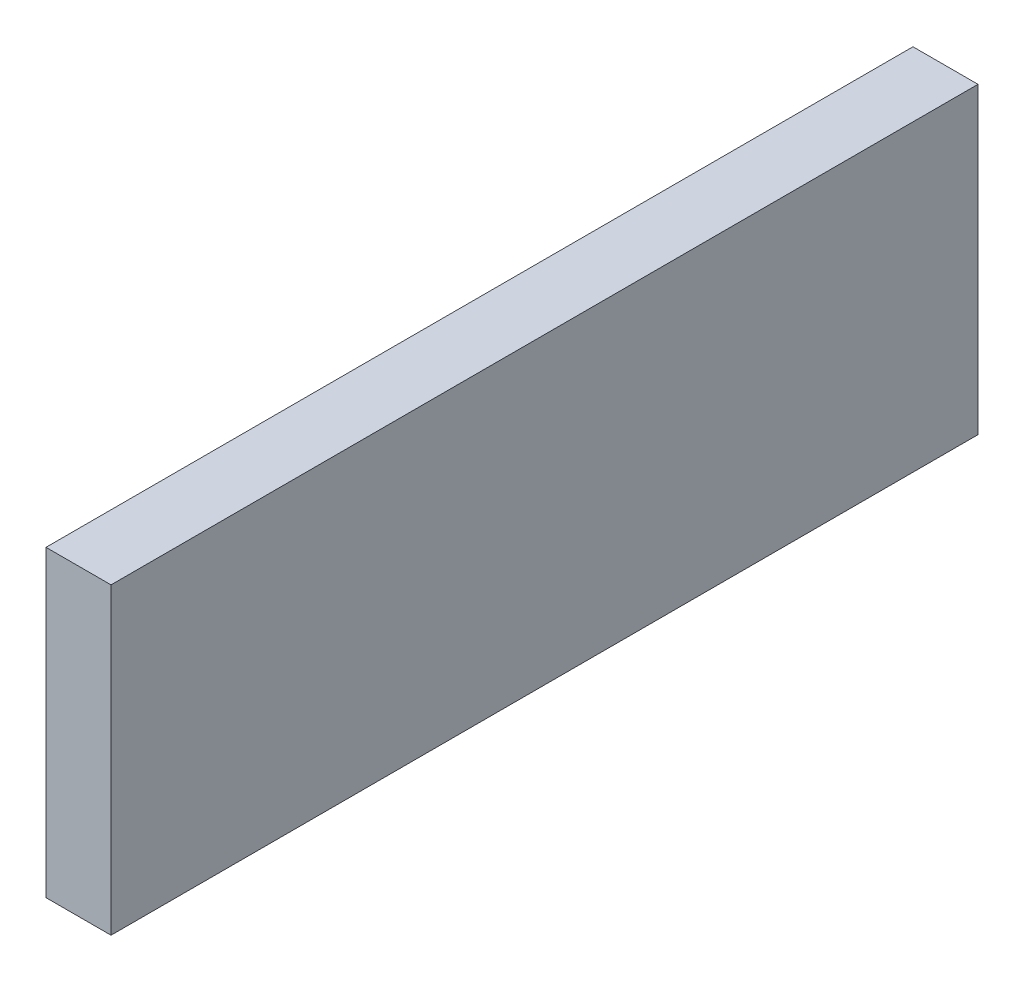
ISO-10303-21;
HEADER;
FILE_DESCRIPTION(('STEP AP214'),'2;1');
FILE_NAME('part.step','',(''),(''),'','','');
FILE_SCHEMA(('AUTOMOTIVE_DESIGN { 1 0 10303 214 1 1 1 1 }'));
ENDSEC;
DATA;
#1=APPLICATION_CONTEXT('core data for automotive mechanical design processes');
#2=APPLICATION_PROTOCOL_DEFINITION('international standard','automotive_design',2000,#1);
#3=PRODUCT_CONTEXT('',#1,'mechanical');
#4=PRODUCT('Part','Part','',(#3));
#5=PRODUCT_RELATED_PRODUCT_CATEGORY('part','',(#4));
#6=PRODUCT_DEFINITION_FORMATION('','',#4);
#7=PRODUCT_DEFINITION_CONTEXT('part definition',#1,'design');
#8=PRODUCT_DEFINITION('design','',#6,#7);
#9=PRODUCT_DEFINITION_SHAPE('','',#8);
#10=(LENGTH_UNIT() NAMED_UNIT(*) SI_UNIT(.MILLI.,.METRE.));
#11=(NAMED_UNIT(*) PLANE_ANGLE_UNIT() SI_UNIT($,.RADIAN.));
#12=(NAMED_UNIT(*) SI_UNIT($,.STERADIAN.) SOLID_ANGLE_UNIT());
#13=UNCERTAINTY_MEASURE_WITH_UNIT(LENGTH_MEASURE(1.E-05),#10,'distance_accuracy_value','');
#14=(GEOMETRIC_REPRESENTATION_CONTEXT(3) GLOBAL_UNCERTAINTY_ASSIGNED_CONTEXT((#13)) GLOBAL_UNIT_ASSIGNED_CONTEXT((#10,
#11,#12)) REPRESENTATION_CONTEXT('',''));
#15=CARTESIAN_POINT('',(0.,0.,0.));
#16=DIRECTION('',(0.,0.,1.));
#17=DIRECTION('',(1.,0.,0.));
#18=AXIS2_PLACEMENT_3D('',#15,#16,#17);
#19=CARTESIAN_POINT('',(3.,-7.,-20.));
#20=DIRECTION('',(0.,0.,1.));
#21=DIRECTION('',(1.,0.,0.));
#22=AXIS2_PLACEMENT_3D('',#19,#20,#21);
#23=PLANE('',#22);
#24=DIRECTION('',(0.,1.,0.));
#25=VECTOR('',#24,1.);
#26=CARTESIAN_POINT('',(0.,-7.,-20.));
#27=LINE('',#26,#25);
#28=CARTESIAN_POINT('',(0.,-7.,-20.));
#29=VERTEX_POINT('',#28);
#30=CARTESIAN_POINT('',(0.,7.,-20.));
#31=VERTEX_POINT('',#30);
#32=EDGE_CURVE('E96',#29,#31,#27,.T.);
#33=ORIENTED_EDGE('',*,*,#32,.T.);
#34=DIRECTION('',(-1.,0.,0.));
#35=VECTOR('',#34,1.);
#36=CARTESIAN_POINT('',(3.,7.,-20.));
#37=LINE('',#36,#35);
#38=CARTESIAN_POINT('',(3.,7.,-20.));
#39=VERTEX_POINT('',#38);
#40=EDGE_CURVE('E11',#39,#31,#37,.T.);
#41=ORIENTED_EDGE('',*,*,#40,.F.);
#42=DIRECTION('',(0.,1.,0.));
#43=VECTOR('',#42,1.);
#44=CARTESIAN_POINT('',(3.,-7.,-20.));
#45=LINE('',#44,#43);
#46=CARTESIAN_POINT('',(3.,-7.,-20.));
#47=VERTEX_POINT('',#46);
#48=EDGE_CURVE('E84',#47,#39,#45,.T.);
#49=ORIENTED_EDGE('',*,*,#48,.F.);
#50=DIRECTION('',(-1.,0.,0.));
#51=VECTOR('',#50,1.);
#52=CARTESIAN_POINT('',(3.,-7.,-20.));
#53=LINE('',#52,#51);
#54=EDGE_CURVE('E92',#47,#29,#53,.T.);
#55=ORIENTED_EDGE('',*,*,#54,.T.);
#56=EDGE_LOOP('',(#33,#41,#49,#55));
#57=FACE_BOUND('',#56,.T.);
#58=ADVANCED_FACE('F33',(#57),#23,.F.);
#59=CARTESIAN_POINT('',(3.,7.,20.));
#60=DIRECTION('',(0.,-1.,0.));
#61=DIRECTION('',(0.,0.,-1.));
#62=AXIS2_PLACEMENT_3D('',#59,#60,#61);
#63=PLANE('',#62);
#64=DIRECTION('',(0.,0.,1.));
#65=VECTOR('',#64,1.);
#66=CARTESIAN_POINT('',(0.,7.,20.));
#67=LINE('',#66,#65);
#68=CARTESIAN_POINT('',(0.,7.,20.));
#69=VERTEX_POINT('',#68);
#70=EDGE_CURVE('E88',#31,#69,#67,.T.);
#71=ORIENTED_EDGE('',*,*,#70,.T.);
#72=DIRECTION('',(-1.,0.,0.));
#73=VECTOR('',#72,1.);
#74=CARTESIAN_POINT('',(3.,7.,20.));
#75=LINE('',#74,#73);
#76=CARTESIAN_POINT('',(3.,7.,20.));
#77=VERTEX_POINT('',#76);
#78=EDGE_CURVE('E41',#77,#69,#75,.T.);
#79=ORIENTED_EDGE('',*,*,#78,.F.);
#80=DIRECTION('',(0.,0.,1.));
#81=VECTOR('',#80,1.);
#82=CARTESIAN_POINT('',(3.,7.,20.));
#83=LINE('',#82,#81);
#84=EDGE_CURVE('E79',#39,#77,#83,.T.);
#85=ORIENTED_EDGE('',*,*,#84,.F.);
#86=ORIENTED_EDGE('',*,*,#40,.T.);
#87=EDGE_LOOP('',(#71,#79,#85,#86));
#88=FACE_BOUND('',#87,.T.);
#89=ADVANCED_FACE('F87',(#88),#63,.F.);
#90=CARTESIAN_POINT('',(3.,-7.,20.));
#91=DIRECTION('',(0.,0.,-1.));
#92=DIRECTION('',(-1.,0.,0.));
#93=AXIS2_PLACEMENT_3D('',#90,#91,#92);
#94=PLANE('',#93);
#95=DIRECTION('',(0.,-1.,0.));
#96=VECTOR('',#95,1.);
#97=CARTESIAN_POINT('',(0.,-7.,20.));
#98=LINE('',#97,#96);
#99=CARTESIAN_POINT('',(0.,-7.,20.));
#100=VERTEX_POINT('',#99);
#101=EDGE_CURVE('E66',#69,#100,#98,.T.);
#102=ORIENTED_EDGE('',*,*,#101,.T.);
#103=DIRECTION('',(-1.,0.,0.));
#104=VECTOR('',#103,1.);
#105=CARTESIAN_POINT('',(3.,-7.,20.));
#106=LINE('',#105,#104);
#107=CARTESIAN_POINT('',(3.,-7.,20.));
#108=VERTEX_POINT('',#107);
#109=EDGE_CURVE('E89',#108,#100,#106,.T.);
#110=ORIENTED_EDGE('',*,*,#109,.F.);
#111=DIRECTION('',(0.,-1.,0.));
#112=VECTOR('',#111,1.);
#113=CARTESIAN_POINT('',(3.,-7.,20.));
#114=LINE('',#113,#112);
#115=EDGE_CURVE('E82',#77,#108,#114,.T.);
#116=ORIENTED_EDGE('',*,*,#115,.F.);
#117=ORIENTED_EDGE('',*,*,#78,.T.);
#118=EDGE_LOOP('',(#102,#110,#116,#117));
#119=FACE_BOUND('',#118,.T.);
#120=ADVANCED_FACE('F90',(#119),#94,.F.);
#121=CARTESIAN_POINT('',(3.,-7.,20.));
#122=DIRECTION('',(0.,1.,0.));
#123=DIRECTION('',(0.,0.,1.));
#124=AXIS2_PLACEMENT_3D('',#121,#122,#123);
#125=PLANE('',#124);
#126=DIRECTION('',(0.,0.,-1.));
#127=VECTOR('',#126,1.);
#128=CARTESIAN_POINT('',(0.,-7.,20.));
#129=LINE('',#128,#127);
#130=EDGE_CURVE('E72',#100,#29,#129,.T.);
#131=ORIENTED_EDGE('',*,*,#130,.T.);
#132=ORIENTED_EDGE('',*,*,#54,.F.);
#133=DIRECTION('',(0.,0.,-1.));
#134=VECTOR('',#133,1.);
#135=CARTESIAN_POINT('',(3.,-7.,20.));
#136=LINE('',#135,#134);
#137=EDGE_CURVE('E49',#108,#47,#136,.T.);
#138=ORIENTED_EDGE('',*,*,#137,.F.);
#139=ORIENTED_EDGE('',*,*,#109,.T.);
#140=EDGE_LOOP('',(#131,#132,#138,#139));
#141=FACE_BOUND('',#140,.T.);
#142=ADVANCED_FACE('F103',(#141),#125,.F.);
#143=CARTESIAN_POINT('',(3.,0.,0.));
#144=DIRECTION('',(-1.,0.,0.));
#145=DIRECTION('',(0.,0.,1.));
#146=AXIS2_PLACEMENT_3D('',#143,#144,#145);
#147=PLANE('',#146);
#148=ORIENTED_EDGE('',*,*,#48,.T.);
#149=ORIENTED_EDGE('',*,*,#84,.T.);
#150=ORIENTED_EDGE('',*,*,#115,.T.);
#151=ORIENTED_EDGE('',*,*,#137,.T.);
#152=EDGE_LOOP('',(#148,#149,#150,#151));
#153=FACE_BOUND('',#152,.T.);
#154=ADVANCED_FACE('F80',(#153),#147,.F.);
#155=CARTESIAN_POINT('',(0.,0.,0.));
#156=DIRECTION('',(-1.,0.,0.));
#157=DIRECTION('',(0.,0.,1.));
#158=AXIS2_PLACEMENT_3D('',#155,#156,#157);
#159=PLANE('',#158);
#160=ORIENTED_EDGE('',*,*,#32,.F.);
#161=ORIENTED_EDGE('',*,*,#130,.F.);
#162=ORIENTED_EDGE('',*,*,#101,.F.);
#163=ORIENTED_EDGE('',*,*,#70,.F.);
#164=EDGE_LOOP('',(#160,#161,#162,#163));
#165=FACE_BOUND('',#164,.T.);
#166=ADVANCED_FACE('F106',(#165),#159,.T.);
#167=CLOSED_SHELL('',(#58,#89,#120,#142,#154,#166));
#168=MANIFOLD_SOLID_BREP('B2',#167);
#169=ADVANCED_BREP_SHAPE_REPRESENTATION('',(#18,#168),#14);
#170=SHAPE_DEFINITION_REPRESENTATION(#9,#169);
ENDSEC;
END-ISO-10303-21;
